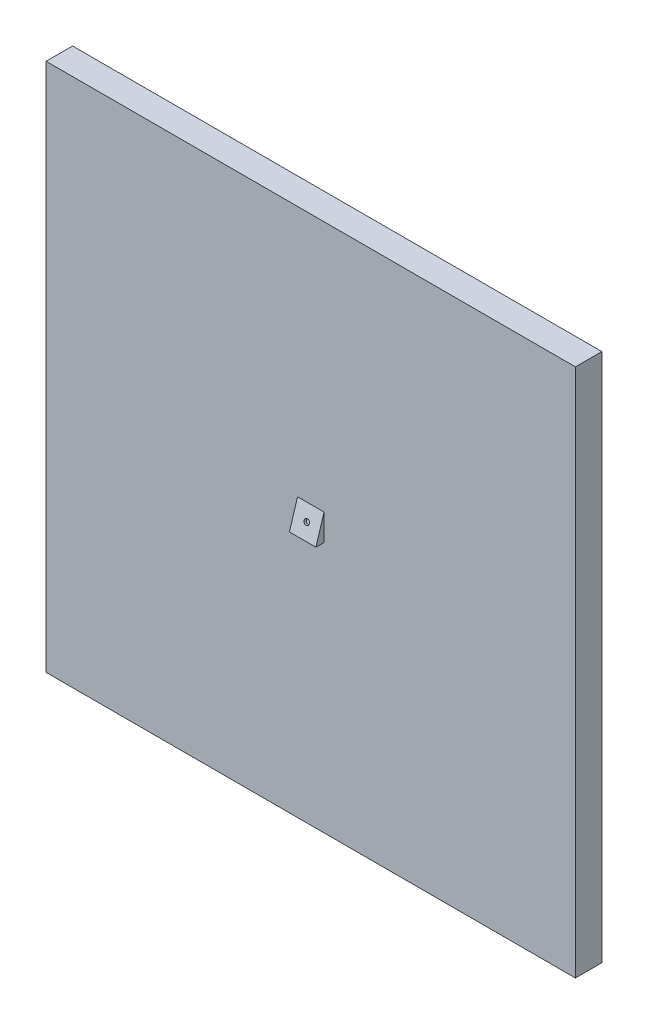
ISO-10303-21;
HEADER;
FILE_DESCRIPTION(('STEP AP214'),'2;1');
FILE_NAME('part.step','',(''),(''),'','','');
FILE_SCHEMA(('AUTOMOTIVE_DESIGN { 1 0 10303 214 1 1 1 1 }'));
ENDSEC;
DATA;
#1=APPLICATION_CONTEXT('core data for automotive mechanical design processes');
#2=APPLICATION_PROTOCOL_DEFINITION('international standard','automotive_design',2000,#1);
#3=PRODUCT_CONTEXT('',#1,'mechanical');
#4=PRODUCT('Part','Part','',(#3));
#5=PRODUCT_RELATED_PRODUCT_CATEGORY('part','',(#4));
#6=PRODUCT_DEFINITION_FORMATION('','',#4);
#7=PRODUCT_DEFINITION_CONTEXT('part definition',#1,'design');
#8=PRODUCT_DEFINITION('design','',#6,#7);
#9=PRODUCT_DEFINITION_SHAPE('','',#8);
#10=(LENGTH_UNIT() NAMED_UNIT(*) SI_UNIT(.MILLI.,.METRE.));
#11=(NAMED_UNIT(*) PLANE_ANGLE_UNIT() SI_UNIT($,.RADIAN.));
#12=(NAMED_UNIT(*) SI_UNIT($,.STERADIAN.) SOLID_ANGLE_UNIT());
#13=UNCERTAINTY_MEASURE_WITH_UNIT(LENGTH_MEASURE(1.E-05),#10,'distance_accuracy_value','');
#14=(GEOMETRIC_REPRESENTATION_CONTEXT(3) GLOBAL_UNCERTAINTY_ASSIGNED_CONTEXT((#13)) GLOBAL_UNIT_ASSIGNED_CONTEXT((#10,
#11,#12)) REPRESENTATION_CONTEXT('',''));
#15=CARTESIAN_POINT('',(0.,0.,0.));
#16=DIRECTION('',(0.,0.,1.));
#17=DIRECTION('',(1.,0.,0.));
#18=AXIS2_PLACEMENT_3D('',#15,#16,#17);
#19=CARTESIAN_POINT('',(0.,0.,1.));
#20=DIRECTION('',(0.,0.,-1.));
#21=DIRECTION('',(-1.,0.,0.));
#22=AXIS2_PLACEMENT_3D('',#19,#20,#21);
#23=PLANE('',#22);
#24=DIRECTION('',(1.,0.,0.));
#25=VECTOR('',#24,1.);
#26=CARTESIAN_POINT('',(-12.5178375411636,-11.875,1.));
#27=LINE('',#26,#25);
#28=CARTESIAN_POINT('',(-12.5178375411636,-11.875,1.));
#29=VERTEX_POINT('',#28);
#30=CARTESIAN_POINT('',(7.48216245883645,-11.875,1.));
#31=VERTEX_POINT('',#30);
#32=EDGE_CURVE('E119',#29,#31,#27,.T.);
#33=ORIENTED_EDGE('',*,*,#32,.T.);
#34=DIRECTION('',(0.,-1.,0.));
#35=VECTOR('',#34,1.);
#36=CARTESIAN_POINT('',(7.48216245883645,8.12500000000001,1.));
#37=LINE('',#36,#35);
#38=CARTESIAN_POINT('',(7.48216245883645,8.12500000000001,1.));
#39=VERTEX_POINT('',#38);
#40=EDGE_CURVE('E121',#39,#31,#37,.T.);
#41=ORIENTED_EDGE('',*,*,#40,.F.);
#42=DIRECTION('',(1.,0.,0.));
#43=VECTOR('',#42,1.);
#44=CARTESIAN_POINT('',(-12.5178375411636,8.12500000000001,1.));
#45=LINE('',#44,#43);
#46=CARTESIAN_POINT('',(-12.5178375411636,8.12500000000001,1.));
#47=VERTEX_POINT('',#46);
#48=EDGE_CURVE('E125',#47,#39,#45,.T.);
#49=ORIENTED_EDGE('',*,*,#48,.F.);
#50=DIRECTION('',(0.,-1.,0.));
#51=VECTOR('',#50,1.);
#52=CARTESIAN_POINT('',(-12.5178375411636,8.12500000000001,1.));
#53=LINE('',#52,#51);
#54=EDGE_CURVE('E128',#47,#29,#53,.T.);
#55=ORIENTED_EDGE('',*,*,#54,.T.);
#56=EDGE_LOOP('',(#33,#41,#49,#55));
#57=FACE_BOUND('',#56,.T.);
#58=DIRECTION('',(0.,-1.,0.));
#59=VECTOR('',#58,1.);
#60=CARTESIAN_POINT('',(-3.01783754116357,-1.37499999999994,1.));
#61=LINE('',#60,#59);
#62=CARTESIAN_POINT('',(-3.01783754116357,-1.37499999999994,1.));
#63=VERTEX_POINT('',#62);
#64=CARTESIAN_POINT('',(-3.01783754116357,-2.37499999999998,1.));
#65=VERTEX_POINT('',#64);
#66=EDGE_CURVE('E104',#63,#65,#61,.T.);
#67=ORIENTED_EDGE('',*,*,#66,.F.);
#68=DIRECTION('',(-1.,0.,0.));
#69=VECTOR('',#68,1.);
#70=CARTESIAN_POINT('',(-3.01783754116357,-1.37499999999994,1.));
#71=LINE('',#70,#69);
#72=CARTESIAN_POINT('',(-2.01783754116356,-1.37499999999995,1.));
#73=VERTEX_POINT('',#72);
#74=EDGE_CURVE('E91',#73,#63,#71,.T.);
#75=ORIENTED_EDGE('',*,*,#74,.F.);
#76=DIRECTION('',(0.,1.,0.));
#77=VECTOR('',#76,1.);
#78=CARTESIAN_POINT('',(-2.01783754116356,-1.37499999999995,1.));
#79=LINE('',#78,#77);
#80=CARTESIAN_POINT('',(-2.01783754116356,-2.37499999999999,1.));
#81=VERTEX_POINT('',#80);
#82=EDGE_CURVE('E55',#81,#73,#79,.T.);
#83=ORIENTED_EDGE('',*,*,#82,.F.);
#84=DIRECTION('',(1.,0.,0.));
#85=VECTOR('',#84,1.);
#86=CARTESIAN_POINT('',(-3.01783754116357,-2.37499999999998,1.));
#87=LINE('',#86,#85);
#88=EDGE_CURVE('E50',#65,#81,#87,.T.);
#89=ORIENTED_EDGE('',*,*,#88,.F.);
#90=EDGE_LOOP('',(#67,#75,#83,#89));
#91=FACE_BOUND('',#90,.T.);
#92=ADVANCED_FACE('F35',(#57,#91),#23,.F.);
#93=CARTESIAN_POINT('',(-12.5178375411636,-11.875,1.));
#94=DIRECTION('',(0.,1.,0.));
#95=DIRECTION('',(0.,0.,1.));
#96=AXIS2_PLACEMENT_3D('',#93,#94,#95);
#97=PLANE('',#96);
#98=DIRECTION('',(1.,0.,0.));
#99=VECTOR('',#98,1.);
#100=CARTESIAN_POINT('',(-12.5178375411636,-11.875,0.));
#101=LINE('',#100,#99);
#102=CARTESIAN_POINT('',(-12.5178375411636,-11.875,0.));
#103=VERTEX_POINT('',#102);
#104=CARTESIAN_POINT('',(7.48216245883645,-11.875,0.));
#105=VERTEX_POINT('',#104);
#106=EDGE_CURVE('E118',#103,#105,#101,.T.);
#107=ORIENTED_EDGE('',*,*,#106,.T.);
#108=DIRECTION('',(0.,0.,-1.));
#109=VECTOR('',#108,1.);
#110=CARTESIAN_POINT('',(7.48216245883645,-11.875,1.));
#111=LINE('',#110,#109);
#112=EDGE_CURVE('E11',#31,#105,#111,.T.);
#113=ORIENTED_EDGE('',*,*,#112,.F.);
#114=ORIENTED_EDGE('',*,*,#32,.F.);
#115=DIRECTION('',(0.,0.,-1.));
#116=VECTOR('',#115,1.);
#117=CARTESIAN_POINT('',(-12.5178375411636,-11.875,1.));
#118=LINE('',#117,#116);
#119=EDGE_CURVE('E130',#29,#103,#118,.T.);
#120=ORIENTED_EDGE('',*,*,#119,.T.);
#121=EDGE_LOOP('',(#107,#113,#114,#120));
#122=FACE_BOUND('',#121,.T.);
#123=ADVANCED_FACE('F37',(#122),#97,.F.);
#124=CARTESIAN_POINT('',(7.48216245883645,8.12500000000001,1.));
#125=DIRECTION('',(1.,0.,0.));
#126=DIRECTION('',(0.,1.,0.));
#127=AXIS2_PLACEMENT_3D('',#124,#125,#126);
#128=PLANE('',#127);
#129=DIRECTION('',(0.,-1.,0.));
#130=VECTOR('',#129,1.);
#131=CARTESIAN_POINT('',(7.48216245883645,8.12500000000001,0.));
#132=LINE('',#131,#130);
#133=CARTESIAN_POINT('',(7.48216245883645,8.12500000000001,0.));
#134=VERTEX_POINT('',#133);
#135=EDGE_CURVE('E133',#134,#105,#132,.T.);
#136=ORIENTED_EDGE('',*,*,#135,.F.);
#137=DIRECTION('',(0.,0.,-1.));
#138=VECTOR('',#137,1.);
#139=CARTESIAN_POINT('',(7.48216245883645,8.12500000000001,1.));
#140=LINE('',#139,#138);
#141=EDGE_CURVE('E43',#39,#134,#140,.T.);
#142=ORIENTED_EDGE('',*,*,#141,.F.);
#143=ORIENTED_EDGE('',*,*,#40,.T.);
#144=ORIENTED_EDGE('',*,*,#112,.T.);
#145=EDGE_LOOP('',(#136,#142,#143,#144));
#146=FACE_BOUND('',#145,.T.);
#147=ADVANCED_FACE('F150',(#146),#128,.T.);
#148=CARTESIAN_POINT('',(-12.5178375411636,8.12500000000001,1.));
#149=DIRECTION('',(0.,1.,0.));
#150=DIRECTION('',(0.,0.,1.));
#151=AXIS2_PLACEMENT_3D('',#148,#149,#150);
#152=PLANE('',#151);
#153=DIRECTION('',(1.,0.,0.));
#154=VECTOR('',#153,1.);
#155=CARTESIAN_POINT('',(-12.5178375411636,8.12500000000001,0.));
#156=LINE('',#155,#154);
#157=CARTESIAN_POINT('',(-12.5178375411636,8.12500000000001,0.));
#158=VERTEX_POINT('',#157);
#159=EDGE_CURVE('E136',#158,#134,#156,.T.);
#160=ORIENTED_EDGE('',*,*,#159,.F.);
#161=DIRECTION('',(0.,0.,-1.));
#162=VECTOR('',#161,1.);
#163=CARTESIAN_POINT('',(-12.5178375411636,8.12500000000001,1.));
#164=LINE('',#163,#162);
#165=EDGE_CURVE('E142',#47,#158,#164,.T.);
#166=ORIENTED_EDGE('',*,*,#165,.F.);
#167=ORIENTED_EDGE('',*,*,#48,.T.);
#168=ORIENTED_EDGE('',*,*,#141,.T.);
#169=EDGE_LOOP('',(#160,#166,#167,#168));
#170=FACE_BOUND('',#169,.T.);
#171=ADVANCED_FACE('F146',(#170),#152,.T.);
#172=CARTESIAN_POINT('',(-12.5178375411636,8.12500000000001,1.));
#173=DIRECTION('',(1.,0.,0.));
#174=DIRECTION('',(0.,0.,-1.));
#175=AXIS2_PLACEMENT_3D('',#172,#173,#174);
#176=PLANE('',#175);
#177=DIRECTION('',(0.,-1.,0.));
#178=VECTOR('',#177,1.);
#179=CARTESIAN_POINT('',(-12.5178375411636,8.12500000000001,0.));
#180=LINE('',#179,#178);
#181=EDGE_CURVE('E122',#158,#103,#180,.T.);
#182=ORIENTED_EDGE('',*,*,#181,.T.);
#183=ORIENTED_EDGE('',*,*,#119,.F.);
#184=ORIENTED_EDGE('',*,*,#54,.F.);
#185=ORIENTED_EDGE('',*,*,#165,.T.);
#186=EDGE_LOOP('',(#182,#183,#184,#185));
#187=FACE_BOUND('',#186,.T.);
#188=ADVANCED_FACE('F158',(#187),#176,.F.);
#189=CARTESIAN_POINT('',(0.,0.,0.));
#190=DIRECTION('',(0.,0.,-1.));
#191=DIRECTION('',(-1.,0.,0.));
#192=AXIS2_PLACEMENT_3D('',#189,#190,#191);
#193=PLANE('',#192);
#194=ORIENTED_EDGE('',*,*,#106,.F.);
#195=ORIENTED_EDGE('',*,*,#181,.F.);
#196=ORIENTED_EDGE('',*,*,#159,.T.);
#197=ORIENTED_EDGE('',*,*,#135,.T.);
#198=EDGE_LOOP('',(#194,#195,#196,#197));
#199=FACE_BOUND('',#198,.T.);
#200=ADVANCED_FACE('F155',(#199),#193,.T.);
#201=CARTESIAN_POINT('',(-3.01783754116357,-1.37499999999994,1.306));
#202=DIRECTION('',(1.,0.,0.));
#203=DIRECTION('',(0.,1.,0.));
#204=AXIS2_PLACEMENT_3D('',#201,#202,#203);
#205=PLANE('',#204);
#206=DIRECTION('',(0.,0.,-1.));
#207=VECTOR('',#206,1.);
#208=CARTESIAN_POINT('',(-3.01783754116357,-2.37499999999998,1.306));
#209=LINE('',#208,#207);
#210=CARTESIAN_POINT('',(-3.01783754116357,-2.37499999999998,1.306));
#211=VERTEX_POINT('',#210);
#212=EDGE_CURVE('E105',#211,#65,#209,.T.);
#213=ORIENTED_EDGE('',*,*,#212,.F.);
#214=DIRECTION('',(0.,-0.956232722151393,0.292607212978314));
#215=VECTOR('',#214,1.);
#216=CARTESIAN_POINT('',(-3.01783754116357,-1.37499999999994,1.));
#217=LINE('',#216,#215);
#218=EDGE_CURVE('E94',#63,#211,#217,.T.);
#219=ORIENTED_EDGE('',*,*,#218,.F.);
#220=ORIENTED_EDGE('',*,*,#66,.T.);
#221=EDGE_LOOP('',(#213,#219,#220));
#222=FACE_BOUND('',#221,.T.);
#223=ADVANCED_FACE('F103',(#222),#205,.F.);
#224=CARTESIAN_POINT('',(-3.01783754116357,-2.37499999999998,1.306));
#225=DIRECTION('',(0.,1.,0.));
#226=DIRECTION('',(-1.,0.,0.));
#227=AXIS2_PLACEMENT_3D('',#224,#225,#226);
#228=PLANE('',#227);
#229=ORIENTED_EDGE('',*,*,#88,.T.);
#230=DIRECTION('',(0.,0.,-1.));
#231=VECTOR('',#230,1.);
#232=CARTESIAN_POINT('',(-2.01783754116356,-2.37499999999999,1.306));
#233=LINE('',#232,#231);
#234=CARTESIAN_POINT('',(-2.01783754116356,-2.37499999999999,1.306));
#235=VERTEX_POINT('',#234);
#236=EDGE_CURVE('E114',#235,#81,#233,.T.);
#237=ORIENTED_EDGE('',*,*,#236,.F.);
#238=DIRECTION('',(1.,0.,0.));
#239=VECTOR('',#238,1.);
#240=CARTESIAN_POINT('',(-3.01783754116357,-2.37499999999998,1.306));
#241=LINE('',#240,#239);
#242=EDGE_CURVE('E98',#211,#235,#241,.T.);
#243=ORIENTED_EDGE('',*,*,#242,.F.);
#244=ORIENTED_EDGE('',*,*,#212,.T.);
#245=EDGE_LOOP('',(#229,#237,#243,#244));
#246=FACE_BOUND('',#245,.T.);
#247=ADVANCED_FACE('F205',(#246),#228,.F.);
#248=CARTESIAN_POINT('',(-2.01783754116356,-1.37499999999995,1.306));
#249=DIRECTION('',(-1.,0.,0.));
#250=DIRECTION('',(0.,0.,1.));
#251=AXIS2_PLACEMENT_3D('',#248,#249,#250);
#252=PLANE('',#251);
#253=ORIENTED_EDGE('',*,*,#82,.T.);
#254=DIRECTION('',(0.,-0.956232722151393,0.292607212978314));
#255=VECTOR('',#254,1.);
#256=CARTESIAN_POINT('',(-2.01783754116356,-1.46061898108689,1.0261994082126));
#257=LINE('',#256,#255);
#258=EDGE_CURVE('E97',#73,#235,#257,.T.);
#259=ORIENTED_EDGE('',*,*,#258,.T.);
#260=ORIENTED_EDGE('',*,*,#236,.T.);
#261=EDGE_LOOP('',(#253,#259,#260));
#262=FACE_BOUND('',#261,.T.);
#263=ADVANCED_FACE('F210',(#262),#252,.F.);
#264=CARTESIAN_POINT('',(7.28816245883644,-1.37499999999998,1.));
#265=DIRECTION('',(0.,-0.292607212978314,-0.956232722151393));
#266=DIRECTION('',(0.,0.956232722151393,-0.292607212978314));
#267=AXIS2_PLACEMENT_3D('',#264,#265,#266);
#268=PLANE('',#267);
#269=CARTESIAN_POINT('',(-2.51783754116356,-1.87499999999997,1.153));
#270=DIRECTION('',(0.,0.292607212978314,0.956232722151393));
#271=DIRECTION('',(0.,-0.956232722151393,0.292607212978314));
#272=AXIS2_PLACEMENT_3D('',#269,#270,#271);
#273=CIRCLE('',#272,0.0999999999999998);
#274=CARTESIAN_POINT('',(-2.51783754116356,-1.97062327221511,1.18226072129783));
#275=VERTEX_POINT('',#274);
#276=EDGE_CURVE('E251',#275,#275,#273,.T.);
#277=ORIENTED_EDGE('',*,*,#276,.F.);
#278=EDGE_LOOP('',(#277));
#279=FACE_BOUND('',#278,.T.);
#280=ORIENTED_EDGE('',*,*,#74,.T.);
#281=ORIENTED_EDGE('',*,*,#218,.T.);
#282=ORIENTED_EDGE('',*,*,#242,.T.);
#283=ORIENTED_EDGE('',*,*,#258,.F.);
#284=EDGE_LOOP('',(#280,#281,#282,#283));
#285=FACE_BOUND('',#284,.T.);
#286=ADVANCED_FACE('F93',(#279,#285),#268,.F.);
#287=CARTESIAN_POINT('',(-2.51783754116356,-1.9042607212978,1.05737672778486));
#288=DIRECTION('',(0.,0.292607212978314,0.956232722151393));
#289=DIRECTION('',(0.,-0.956232722151393,0.292607212978314));
#290=AXIS2_PLACEMENT_3D('',#287,#288,#289);
#291=CYLINDRICAL_SURFACE('',#290,0.0999999999999998);
#292=CARTESIAN_POINT('',(-2.51783754116356,-1.9042607212978,1.05737672778486));
#293=DIRECTION('',(0.,0.292607212978314,0.956232722151393));
#294=DIRECTION('',(0.,-0.956232722151393,0.292607212978314));
#295=AXIS2_PLACEMENT_3D('',#292,#293,#294);
#296=CIRCLE('',#295,0.0999999999999998);
#297=CARTESIAN_POINT('',(-2.51783754116356,-1.99988399351294,1.08663744908269));
#298=VERTEX_POINT('',#297);
#299=EDGE_CURVE('E106',#298,#298,#296,.T.);
#300=ORIENTED_EDGE('',*,*,#299,.F.);
#301=EDGE_LOOP('',(#300));
#302=FACE_BOUND('',#301,.T.);
#303=ORIENTED_EDGE('',*,*,#276,.T.);
#304=EDGE_LOOP('',(#303));
#305=FACE_BOUND('',#304,.T.);
#306=ADVANCED_FACE('F225',(#302,#305),#291,.F.);
#307=CARTESIAN_POINT('',(-2.51783754116356,-1.9042607212978,1.05737672778486));
#308=DIRECTION('',(0.,0.292607212978314,0.956232722151393));
#309=DIRECTION('',(0.,-0.956232722151393,0.292607212978314));
#310=AXIS2_PLACEMENT_3D('',#307,#308,#309);
#311=PLANE('',#310);
#312=ORIENTED_EDGE('',*,*,#299,.T.);
#313=EDGE_LOOP('',(#312));
#314=FACE_BOUND('',#313,.T.);
#315=ADVANCED_FACE('F235',(#314),#311,.T.);
#316=CLOSED_SHELL('',(#92,#123,#147,#171,#188,#200,#223,#247,#263,#286,#306,#315));
#317=MANIFOLD_SOLID_BREP('B2',#316);
#318=ADVANCED_BREP_SHAPE_REPRESENTATION('',(#18,#317),#14);
#319=SHAPE_DEFINITION_REPRESENTATION(#9,#318);
ENDSEC;
END-ISO-10303-21;
